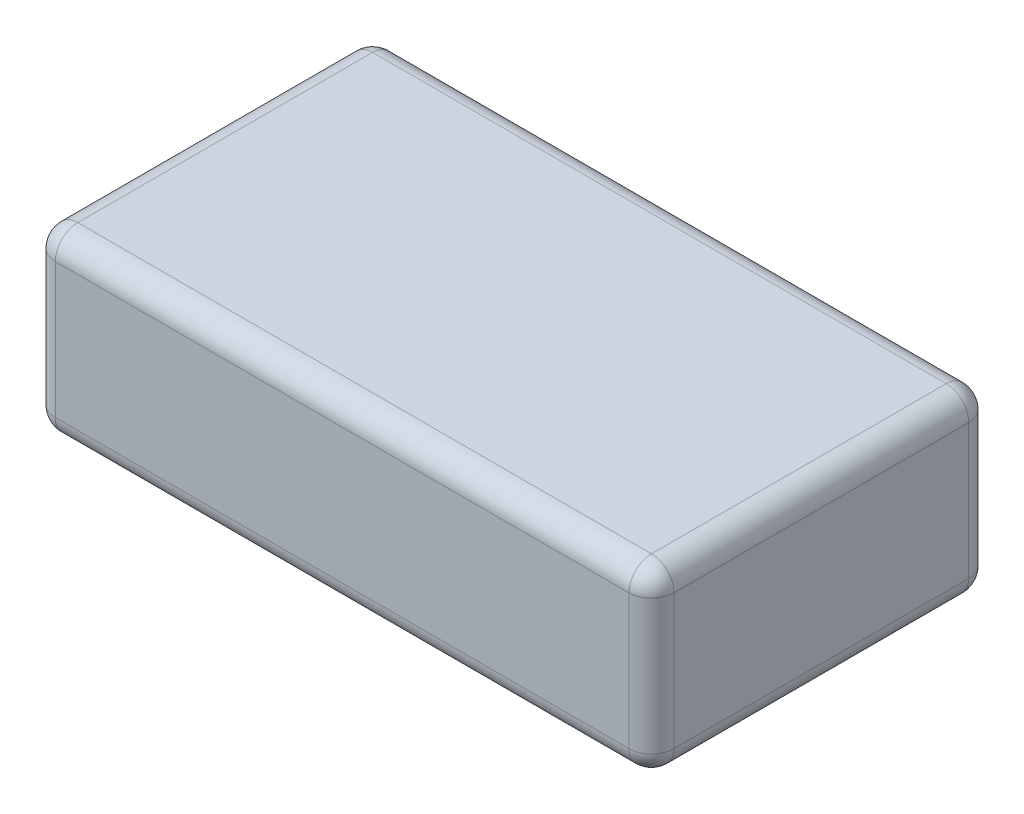
ISO-10303-21;
HEADER;
FILE_DESCRIPTION(('STEP AP214'),'2;1');
FILE_NAME('part.step','',(''),(''),'','','');
FILE_SCHEMA(('AUTOMOTIVE_DESIGN { 1 0 10303 214 1 1 1 1 }'));
ENDSEC;
DATA;
#1=APPLICATION_CONTEXT('core data for automotive mechanical design processes');
#2=APPLICATION_PROTOCOL_DEFINITION('international standard','automotive_design',2000,#1);
#3=PRODUCT_CONTEXT('',#1,'mechanical');
#4=PRODUCT('Part','Part','',(#3));
#5=PRODUCT_RELATED_PRODUCT_CATEGORY('part','',(#4));
#6=PRODUCT_DEFINITION_FORMATION('','',#4);
#7=PRODUCT_DEFINITION_CONTEXT('part definition',#1,'design');
#8=PRODUCT_DEFINITION('design','',#6,#7);
#9=PRODUCT_DEFINITION_SHAPE('','',#8);
#10=(LENGTH_UNIT() NAMED_UNIT(*) SI_UNIT(.MILLI.,.METRE.));
#11=(NAMED_UNIT(*) PLANE_ANGLE_UNIT() SI_UNIT($,.RADIAN.));
#12=(NAMED_UNIT(*) SI_UNIT($,.STERADIAN.) SOLID_ANGLE_UNIT());
#13=UNCERTAINTY_MEASURE_WITH_UNIT(LENGTH_MEASURE(1.E-05),#10,'distance_accuracy_value','');
#14=(GEOMETRIC_REPRESENTATION_CONTEXT(3) GLOBAL_UNCERTAINTY_ASSIGNED_CONTEXT((#13)) GLOBAL_UNIT_ASSIGNED_CONTEXT((#10,
#11,#12)) REPRESENTATION_CONTEXT('',''));
#15=CARTESIAN_POINT('',(0.,0.,0.));
#16=DIRECTION('',(0.,0.,1.));
#17=DIRECTION('',(1.,0.,0.));
#18=AXIS2_PLACEMENT_3D('',#15,#16,#17);
#19=CARTESIAN_POINT('',(27.5,16.,-15.1));
#20=DIRECTION('',(-1.,0.,0.));
#21=DIRECTION('',(0.,0.,1.));
#22=AXIS2_PLACEMENT_3D('',#19,#20,#21);
#23=PLANE('',#22);
#24=DIRECTION('',(0.,0.,-1.));
#25=VECTOR('',#24,1.);
#26=CARTESIAN_POINT('',(27.5,14.,15.1));
#27=LINE('',#26,#25);
#28=CARTESIAN_POINT('',(27.5,14.,-13.1));
#29=VERTEX_POINT('',#28);
#30=CARTESIAN_POINT('',(27.5,14.,13.1));
#31=VERTEX_POINT('',#30);
#32=EDGE_CURVE('E41',#29,#31,#27,.F.);
#33=ORIENTED_EDGE('',*,*,#32,.T.);
#34=DIRECTION('',(0.,-1.,0.));
#35=VECTOR('',#34,1.);
#36=CARTESIAN_POINT('',(27.5,16.,13.1));
#37=LINE('',#36,#35);
#38=CARTESIAN_POINT('',(27.5,2.,13.1));
#39=VERTEX_POINT('',#38);
#40=EDGE_CURVE('E11',#31,#39,#37,.T.);
#41=ORIENTED_EDGE('',*,*,#40,.T.);
#42=DIRECTION('',(0.,0.,-1.));
#43=VECTOR('',#42,1.);
#44=CARTESIAN_POINT('',(27.5,2.,-15.1));
#45=LINE('',#44,#43);
#46=CARTESIAN_POINT('',(27.5,2.,-13.1));
#47=VERTEX_POINT('',#46);
#48=EDGE_CURVE('E232',#39,#47,#45,.T.);
#49=ORIENTED_EDGE('',*,*,#48,.T.);
#50=DIRECTION('',(0.,-1.,0.));
#51=VECTOR('',#50,1.);
#52=CARTESIAN_POINT('',(27.5,16.,-13.1));
#53=LINE('',#52,#51);
#54=EDGE_CURVE('E52',#47,#29,#53,.F.);
#55=ORIENTED_EDGE('',*,*,#54,.T.);
#56=EDGE_LOOP('',(#33,#41,#49,#55));
#57=FACE_BOUND('',#56,.T.);
#58=ADVANCED_FACE('F32',(#57),#23,.F.);
#59=CARTESIAN_POINT('',(-27.5,16.,-15.1));
#60=DIRECTION('',(0.,0.,1.));
#61=DIRECTION('',(1.,0.,0.));
#62=AXIS2_PLACEMENT_3D('',#59,#60,#61);
#63=PLANE('',#62);
#64=DIRECTION('',(0.,-1.,0.));
#65=VECTOR('',#64,1.);
#66=CARTESIAN_POINT('',(-25.5,16.,-15.1));
#67=LINE('',#66,#65);
#68=CARTESIAN_POINT('',(-25.5,2.,-15.1));
#69=VERTEX_POINT('',#68);
#70=CARTESIAN_POINT('',(-25.5,14.,-15.1));
#71=VERTEX_POINT('',#70);
#72=EDGE_CURVE('E216',#69,#71,#67,.F.);
#73=ORIENTED_EDGE('',*,*,#72,.T.);
#74=DIRECTION('',(-1.,0.,0.));
#75=VECTOR('',#74,1.);
#76=CARTESIAN_POINT('',(27.5,14.,-15.1));
#77=LINE('',#76,#75);
#78=CARTESIAN_POINT('',(25.5,14.,-15.1));
#79=VERTEX_POINT('',#78);
#80=EDGE_CURVE('E213',#71,#79,#77,.F.);
#81=ORIENTED_EDGE('',*,*,#80,.T.);
#82=DIRECTION('',(0.,-1.,0.));
#83=VECTOR('',#82,1.);
#84=CARTESIAN_POINT('',(25.5,16.,-15.1));
#85=LINE('',#84,#83);
#86=CARTESIAN_POINT('',(25.5,2.,-15.1));
#87=VERTEX_POINT('',#86);
#88=EDGE_CURVE('E206',#79,#87,#85,.T.);
#89=ORIENTED_EDGE('',*,*,#88,.T.);
#90=DIRECTION('',(-1.,0.,0.));
#91=VECTOR('',#90,1.);
#92=CARTESIAN_POINT('',(-27.5,2.,-15.1));
#93=LINE('',#92,#91);
#94=EDGE_CURVE('E209',#87,#69,#93,.T.);
#95=ORIENTED_EDGE('',*,*,#94,.T.);
#96=EDGE_LOOP('',(#73,#81,#89,#95));
#97=FACE_BOUND('',#96,.T.);
#98=ADVANCED_FACE('F214',(#97),#63,.F.);
#99=CARTESIAN_POINT('',(-27.5,16.,-15.1));
#100=DIRECTION('',(1.,0.,0.));
#101=DIRECTION('',(0.,0.,-1.));
#102=AXIS2_PLACEMENT_3D('',#99,#100,#101);
#103=PLANE('',#102);
#104=DIRECTION('',(0.,0.,1.));
#105=VECTOR('',#104,1.);
#106=CARTESIAN_POINT('',(-27.5,2.,-15.1));
#107=LINE('',#106,#105);
#108=CARTESIAN_POINT('',(-27.5,2.,-13.1));
#109=VERTEX_POINT('',#108);
#110=CARTESIAN_POINT('',(-27.5,2.,13.1));
#111=VERTEX_POINT('',#110);
#112=EDGE_CURVE('E269',#109,#111,#107,.T.);
#113=ORIENTED_EDGE('',*,*,#112,.T.);
#114=DIRECTION('',(0.,-1.,0.));
#115=VECTOR('',#114,1.);
#116=CARTESIAN_POINT('',(-27.5,16.,13.1));
#117=LINE('',#116,#115);
#118=CARTESIAN_POINT('',(-27.5,14.,13.1));
#119=VERTEX_POINT('',#118);
#120=EDGE_CURVE('E263',#111,#119,#117,.F.);
#121=ORIENTED_EDGE('',*,*,#120,.T.);
#122=DIRECTION('',(0.,0.,1.));
#123=VECTOR('',#122,1.);
#124=CARTESIAN_POINT('',(-27.5,14.,-15.1));
#125=LINE('',#124,#123);
#126=CARTESIAN_POINT('',(-27.5,14.,-13.1));
#127=VERTEX_POINT('',#126);
#128=EDGE_CURVE('E257',#119,#127,#125,.F.);
#129=ORIENTED_EDGE('',*,*,#128,.T.);
#130=DIRECTION('',(0.,-1.,0.));
#131=VECTOR('',#130,1.);
#132=CARTESIAN_POINT('',(-27.5,16.,-13.1));
#133=LINE('',#132,#131);
#134=EDGE_CURVE('E264',#127,#109,#133,.T.);
#135=ORIENTED_EDGE('',*,*,#134,.T.);
#136=EDGE_LOOP('',(#113,#121,#129,#135));
#137=FACE_BOUND('',#136,.T.);
#138=ADVANCED_FACE('F267',(#137),#103,.F.);
#139=CARTESIAN_POINT('',(-27.5,16.,15.1));
#140=DIRECTION('',(0.,0.,-1.));
#141=DIRECTION('',(-1.,0.,0.));
#142=AXIS2_PLACEMENT_3D('',#139,#140,#141);
#143=PLANE('',#142);
#144=DIRECTION('',(1.,0.,0.));
#145=VECTOR('',#144,1.);
#146=CARTESIAN_POINT('',(-27.5,14.,15.1));
#147=LINE('',#146,#145);
#148=CARTESIAN_POINT('',(25.5,14.,15.1));
#149=VERTEX_POINT('',#148);
#150=CARTESIAN_POINT('',(-25.5,14.,15.1));
#151=VERTEX_POINT('',#150);
#152=EDGE_CURVE('E131',#149,#151,#147,.F.);
#153=ORIENTED_EDGE('',*,*,#152,.T.);
#154=DIRECTION('',(0.,-1.,0.));
#155=VECTOR('',#154,1.);
#156=CARTESIAN_POINT('',(-25.5,16.,15.1));
#157=LINE('',#156,#155);
#158=CARTESIAN_POINT('',(-25.5,2.,15.1));
#159=VERTEX_POINT('',#158);
#160=EDGE_CURVE('E127',#151,#159,#157,.T.);
#161=ORIENTED_EDGE('',*,*,#160,.T.);
#162=DIRECTION('',(1.,0.,0.));
#163=VECTOR('',#162,1.);
#164=CARTESIAN_POINT('',(-27.5,2.,15.1));
#165=LINE('',#164,#163);
#166=CARTESIAN_POINT('',(25.5,2.,15.1));
#167=VERTEX_POINT('',#166);
#168=EDGE_CURVE('E121',#159,#167,#165,.T.);
#169=ORIENTED_EDGE('',*,*,#168,.T.);
#170=DIRECTION('',(0.,-1.,0.));
#171=VECTOR('',#170,1.);
#172=CARTESIAN_POINT('',(25.5,16.,15.1));
#173=LINE('',#172,#171);
#174=EDGE_CURVE('E124',#167,#149,#173,.F.);
#175=ORIENTED_EDGE('',*,*,#174,.T.);
#176=EDGE_LOOP('',(#153,#161,#169,#175));
#177=FACE_BOUND('',#176,.T.);
#178=ADVANCED_FACE('F123',(#177),#143,.F.);
#179=CARTESIAN_POINT('',(0.,16.,0.));
#180=DIRECTION('',(0.,1.,0.));
#181=DIRECTION('',(0.,0.,1.));
#182=AXIS2_PLACEMENT_3D('',#179,#180,#181);
#183=PLANE('',#182);
#184=DIRECTION('',(0.,0.,1.));
#185=VECTOR('',#184,1.);
#186=CARTESIAN_POINT('',(-25.5,16.,15.1));
#187=LINE('',#186,#185);
#188=CARTESIAN_POINT('',(-25.5,16.,-13.1));
#189=VERTEX_POINT('',#188);
#190=CARTESIAN_POINT('',(-25.5,16.,13.1));
#191=VERTEX_POINT('',#190);
#192=EDGE_CURVE('E280',#189,#191,#187,.T.);
#193=ORIENTED_EDGE('',*,*,#192,.T.);
#194=DIRECTION('',(1.,0.,0.));
#195=VECTOR('',#194,1.);
#196=CARTESIAN_POINT('',(27.5,16.,13.1));
#197=LINE('',#196,#195);
#198=CARTESIAN_POINT('',(25.5,16.,13.1));
#199=VERTEX_POINT('',#198);
#200=EDGE_CURVE('E210',#191,#199,#197,.T.);
#201=ORIENTED_EDGE('',*,*,#200,.T.);
#202=DIRECTION('',(0.,0.,-1.));
#203=VECTOR('',#202,1.);
#204=CARTESIAN_POINT('',(25.5,16.,-15.1));
#205=LINE('',#204,#203);
#206=CARTESIAN_POINT('',(25.5,16.,-13.1));
#207=VERTEX_POINT('',#206);
#208=EDGE_CURVE('E273',#199,#207,#205,.T.);
#209=ORIENTED_EDGE('',*,*,#208,.T.);
#210=DIRECTION('',(-1.,0.,0.));
#211=VECTOR('',#210,1.);
#212=CARTESIAN_POINT('',(-27.5,16.,-13.1));
#213=LINE('',#212,#211);
#214=EDGE_CURVE('E275',#207,#189,#213,.T.);
#215=ORIENTED_EDGE('',*,*,#214,.T.);
#216=EDGE_LOOP('',(#193,#201,#209,#215));
#217=FACE_BOUND('',#216,.T.);
#218=ADVANCED_FACE('F305',(#217),#183,.T.);
#219=CARTESIAN_POINT('',(0.,0.,0.));
#220=DIRECTION('',(0.,1.,0.));
#221=DIRECTION('',(0.,0.,1.));
#222=AXIS2_PLACEMENT_3D('',#219,#220,#221);
#223=PLANE('',#222);
#224=DIRECTION('',(0.,0.,1.));
#225=VECTOR('',#224,1.);
#226=CARTESIAN_POINT('',(-25.5,0.,0.));
#227=LINE('',#226,#225);
#228=CARTESIAN_POINT('',(-25.5,0.,13.1));
#229=VERTEX_POINT('',#228);
#230=CARTESIAN_POINT('',(-25.5,0.,-13.1));
#231=VERTEX_POINT('',#230);
#232=EDGE_CURVE('E227',#229,#231,#227,.F.);
#233=ORIENTED_EDGE('',*,*,#232,.T.);
#234=DIRECTION('',(-1.,0.,0.));
#235=VECTOR('',#234,1.);
#236=CARTESIAN_POINT('',(0.,0.,-13.1));
#237=LINE('',#236,#235);
#238=CARTESIAN_POINT('',(25.5,0.,-13.1));
#239=VERTEX_POINT('',#238);
#240=EDGE_CURVE('E229',#231,#239,#237,.F.);
#241=ORIENTED_EDGE('',*,*,#240,.T.);
#242=DIRECTION('',(0.,0.,-1.));
#243=VECTOR('',#242,1.);
#244=CARTESIAN_POINT('',(25.5,0.,0.));
#245=LINE('',#244,#243);
#246=CARTESIAN_POINT('',(25.5,0.,13.1));
#247=VERTEX_POINT('',#246);
#248=EDGE_CURVE('E220',#239,#247,#245,.F.);
#249=ORIENTED_EDGE('',*,*,#248,.T.);
#250=DIRECTION('',(1.,0.,0.));
#251=VECTOR('',#250,1.);
#252=CARTESIAN_POINT('',(0.,0.,13.1));
#253=LINE('',#252,#251);
#254=EDGE_CURVE('E152',#247,#229,#253,.F.);
#255=ORIENTED_EDGE('',*,*,#254,.T.);
#256=EDGE_LOOP('',(#233,#241,#249,#255));
#257=FACE_BOUND('',#256,.T.);
#258=ADVANCED_FACE('F476',(#257),#223,.F.);
#259=CARTESIAN_POINT('',(25.5,16.,-13.1));
#260=DIRECTION('',(0.,-1.,0.));
#261=DIRECTION('',(0.,0.,-1.));
#262=AXIS2_PLACEMENT_3D('',#259,#260,#261);
#263=CYLINDRICAL_SURFACE('',#262,2.);
#264=CARTESIAN_POINT('',(25.5,14.,-13.1));
#265=DIRECTION('',(0.,1.,0.));
#266=DIRECTION('',(0.,0.,1.));
#267=AXIS2_PLACEMENT_3D('',#264,#265,#266);
#268=CIRCLE('',#267,2.);
#269=EDGE_CURVE('E36',#29,#79,#268,.T.);
#270=ORIENTED_EDGE('',*,*,#269,.F.);
#271=ORIENTED_EDGE('',*,*,#54,.F.);
#272=CARTESIAN_POINT('',(25.5,2.,-13.1));
#273=DIRECTION('',(0.,-1.,0.));
#274=DIRECTION('',(0.,0.,-1.));
#275=AXIS2_PLACEMENT_3D('',#272,#273,#274);
#276=CIRCLE('',#275,2.);
#277=EDGE_CURVE('E192',#87,#47,#276,.T.);
#278=ORIENTED_EDGE('',*,*,#277,.F.);
#279=ORIENTED_EDGE('',*,*,#88,.F.);
#280=EDGE_LOOP('',(#270,#271,#278,#279));
#281=FACE_BOUND('',#280,.T.);
#282=ADVANCED_FACE('F34',(#281),#263,.T.);
#283=CARTESIAN_POINT('',(25.5,14.,-13.1));
#284=DIRECTION('',(0.,0.,1.));
#285=DIRECTION('',(1.,0.,0.));
#286=AXIS2_PLACEMENT_3D('',#283,#284,#285);
#287=SPHERICAL_SURFACE('',#286,2.);
#288=CARTESIAN_POINT('',(25.5,14.,-13.1));
#289=DIRECTION('',(0.,0.,-1.));
#290=DIRECTION('',(-1.,0.,0.));
#291=AXIS2_PLACEMENT_3D('',#288,#289,#290);
#292=CIRCLE('',#291,2.);
#293=EDGE_CURVE('E188',#29,#207,#292,.F.);
#294=ORIENTED_EDGE('',*,*,#293,.F.);
#295=ORIENTED_EDGE('',*,*,#269,.T.);
#296=CARTESIAN_POINT('',(25.5,14.,-13.1));
#297=DIRECTION('',(1.,0.,0.));
#298=DIRECTION('',(0.,0.,-1.));
#299=AXIS2_PLACEMENT_3D('',#296,#297,#298);
#300=CIRCLE('',#299,2.);
#301=EDGE_CURVE('E191',#207,#79,#300,.F.);
#302=ORIENTED_EDGE('',*,*,#301,.F.);
#303=EDGE_LOOP('',(#294,#295,#302));
#304=FACE_BOUND('',#303,.T.);
#305=ADVANCED_FACE('F203',(#304),#287,.T.);
#306=CARTESIAN_POINT('',(25.5,2.,-13.1));
#307=DIRECTION('',(0.,0.,1.));
#308=DIRECTION('',(1.,0.,0.));
#309=AXIS2_PLACEMENT_3D('',#306,#307,#308);
#310=SPHERICAL_SURFACE('',#309,2.);
#311=CARTESIAN_POINT('',(25.5,2.,-13.1));
#312=DIRECTION('',(1.,0.,0.));
#313=DIRECTION('',(0.,0.,-1.));
#314=AXIS2_PLACEMENT_3D('',#311,#312,#313);
#315=CIRCLE('',#314,2.);
#316=EDGE_CURVE('E182',#87,#239,#315,.F.);
#317=ORIENTED_EDGE('',*,*,#316,.F.);
#318=ORIENTED_EDGE('',*,*,#277,.T.);
#319=CARTESIAN_POINT('',(25.5,2.,-13.1));
#320=DIRECTION('',(0.,0.,-1.));
#321=DIRECTION('',(-1.,0.,0.));
#322=AXIS2_PLACEMENT_3D('',#319,#320,#321);
#323=CIRCLE('',#322,2.);
#324=EDGE_CURVE('E185',#239,#47,#323,.F.);
#325=ORIENTED_EDGE('',*,*,#324,.F.);
#326=EDGE_LOOP('',(#317,#318,#325));
#327=FACE_BOUND('',#326,.T.);
#328=ADVANCED_FACE('F455',(#327),#310,.T.);
#329=CARTESIAN_POINT('',(0.,14.,-13.1));
#330=DIRECTION('',(1.,0.,0.));
#331=DIRECTION('',(0.,0.,-1.));
#332=AXIS2_PLACEMENT_3D('',#329,#330,#331);
#333=CYLINDRICAL_SURFACE('',#332,2.);
#334=ORIENTED_EDGE('',*,*,#301,.T.);
#335=ORIENTED_EDGE('',*,*,#80,.F.);
#336=CARTESIAN_POINT('',(-25.5,14.,-13.1));
#337=DIRECTION('',(-1.,0.,0.));
#338=DIRECTION('',(0.,0.,1.));
#339=AXIS2_PLACEMENT_3D('',#336,#337,#338);
#340=CIRCLE('',#339,2.);
#341=EDGE_CURVE('E176',#189,#71,#340,.T.);
#342=ORIENTED_EDGE('',*,*,#341,.F.);
#343=ORIENTED_EDGE('',*,*,#214,.F.);
#344=EDGE_LOOP('',(#334,#335,#342,#343));
#345=FACE_BOUND('',#344,.T.);
#346=ADVANCED_FACE('F307',(#345),#333,.T.);
#347=CARTESIAN_POINT('',(25.5,14.,0.));
#348=DIRECTION('',(0.,0.,1.));
#349=DIRECTION('',(1.,0.,0.));
#350=AXIS2_PLACEMENT_3D('',#347,#348,#349);
#351=CYLINDRICAL_SURFACE('',#350,2.);
#352=ORIENTED_EDGE('',*,*,#293,.T.);
#353=ORIENTED_EDGE('',*,*,#208,.F.);
#354=CARTESIAN_POINT('',(25.5,14.,13.1));
#355=DIRECTION('',(0.,0.,1.));
#356=DIRECTION('',(0.,-1.,0.));
#357=AXIS2_PLACEMENT_3D('',#354,#355,#356);
#358=CIRCLE('',#357,2.);
#359=EDGE_CURVE('E173',#31,#199,#358,.T.);
#360=ORIENTED_EDGE('',*,*,#359,.F.);
#361=ORIENTED_EDGE('',*,*,#32,.F.);
#362=EDGE_LOOP('',(#352,#353,#360,#361));
#363=FACE_BOUND('',#362,.T.);
#364=ADVANCED_FACE('F439',(#363),#351,.T.);
#365=CARTESIAN_POINT('',(25.5,16.,13.1));
#366=DIRECTION('',(0.,-1.,0.));
#367=DIRECTION('',(0.,0.,-1.));
#368=AXIS2_PLACEMENT_3D('',#365,#366,#367);
#369=CYLINDRICAL_SURFACE('',#368,2.);
#370=CARTESIAN_POINT('',(25.5,2.,13.1));
#371=DIRECTION('',(0.,-1.,0.));
#372=DIRECTION('',(0.,0.,-1.));
#373=AXIS2_PLACEMENT_3D('',#370,#371,#372);
#374=CIRCLE('',#373,2.);
#375=EDGE_CURVE('E137',#39,#167,#374,.T.);
#376=ORIENTED_EDGE('',*,*,#375,.F.);
#377=ORIENTED_EDGE('',*,*,#40,.F.);
#378=CARTESIAN_POINT('',(25.5,14.,13.1));
#379=DIRECTION('',(0.,1.,0.));
#380=DIRECTION('',(0.,0.,1.));
#381=AXIS2_PLACEMENT_3D('',#378,#379,#380);
#382=CIRCLE('',#381,2.);
#383=EDGE_CURVE('E140',#149,#31,#382,.T.);
#384=ORIENTED_EDGE('',*,*,#383,.F.);
#385=ORIENTED_EDGE('',*,*,#174,.F.);
#386=EDGE_LOOP('',(#376,#377,#384,#385));
#387=FACE_BOUND('',#386,.T.);
#388=ADVANCED_FACE('F136',(#387),#369,.T.);
#389=CARTESIAN_POINT('',(25.5,2.,-15.1));
#390=DIRECTION('',(0.,0.,-1.));
#391=DIRECTION('',(-1.,0.,0.));
#392=AXIS2_PLACEMENT_3D('',#389,#390,#391);
#393=CYLINDRICAL_SURFACE('',#392,2.);
#394=ORIENTED_EDGE('',*,*,#324,.T.);
#395=ORIENTED_EDGE('',*,*,#48,.F.);
#396=CARTESIAN_POINT('',(25.5,2.,13.1));
#397=DIRECTION('',(0.,0.,1.));
#398=DIRECTION('',(1.,0.,0.));
#399=AXIS2_PLACEMENT_3D('',#396,#397,#398);
#400=CIRCLE('',#399,2.);
#401=EDGE_CURVE('E149',#247,#39,#400,.T.);
#402=ORIENTED_EDGE('',*,*,#401,.F.);
#403=ORIENTED_EDGE('',*,*,#248,.F.);
#404=EDGE_LOOP('',(#394,#395,#402,#403));
#405=FACE_BOUND('',#404,.T.);
#406=ADVANCED_FACE('F423',(#405),#393,.T.);
#407=CARTESIAN_POINT('',(-27.5,2.,-13.1));
#408=DIRECTION('',(-1.,0.,0.));
#409=DIRECTION('',(0.,0.,1.));
#410=AXIS2_PLACEMENT_3D('',#407,#408,#409);
#411=CYLINDRICAL_SURFACE('',#410,2.);
#412=ORIENTED_EDGE('',*,*,#316,.T.);
#413=ORIENTED_EDGE('',*,*,#240,.F.);
#414=CARTESIAN_POINT('',(-25.5,2.,-13.1));
#415=DIRECTION('',(-1.,0.,0.));
#416=DIRECTION('',(0.,0.,1.));
#417=AXIS2_PLACEMENT_3D('',#414,#415,#416);
#418=CIRCLE('',#417,2.);
#419=EDGE_CURVE('E168',#69,#231,#418,.T.);
#420=ORIENTED_EDGE('',*,*,#419,.F.);
#421=ORIENTED_EDGE('',*,*,#94,.F.);
#422=EDGE_LOOP('',(#412,#413,#420,#421));
#423=FACE_BOUND('',#422,.T.);
#424=ADVANCED_FACE('F291',(#423),#411,.T.);
#425=CARTESIAN_POINT('',(-25.5,16.,-13.1));
#426=DIRECTION('',(0.,-1.,0.));
#427=DIRECTION('',(0.,0.,-1.));
#428=AXIS2_PLACEMENT_3D('',#425,#426,#427);
#429=CYLINDRICAL_SURFACE('',#428,2.);
#430=CARTESIAN_POINT('',(-25.5,14.,-13.1));
#431=DIRECTION('',(0.,1.,0.));
#432=DIRECTION('',(0.,0.,1.));
#433=AXIS2_PLACEMENT_3D('',#430,#431,#432);
#434=CIRCLE('',#433,2.);
#435=EDGE_CURVE('E179',#71,#127,#434,.T.);
#436=ORIENTED_EDGE('',*,*,#435,.F.);
#437=ORIENTED_EDGE('',*,*,#72,.F.);
#438=CARTESIAN_POINT('',(-25.5,2.,-13.1));
#439=DIRECTION('',(0.,-1.,0.));
#440=DIRECTION('',(0.,0.,-1.));
#441=AXIS2_PLACEMENT_3D('',#438,#439,#440);
#442=CIRCLE('',#441,2.);
#443=EDGE_CURVE('E165',#109,#69,#442,.T.);
#444=ORIENTED_EDGE('',*,*,#443,.F.);
#445=ORIENTED_EDGE('',*,*,#134,.F.);
#446=EDGE_LOOP('',(#436,#437,#444,#445));
#447=FACE_BOUND('',#446,.T.);
#448=ADVANCED_FACE('F288',(#447),#429,.T.);
#449=CARTESIAN_POINT('',(-25.5,14.,-13.1));
#450=DIRECTION('',(0.,0.,1.));
#451=DIRECTION('',(1.,0.,0.));
#452=AXIS2_PLACEMENT_3D('',#449,#450,#451);
#453=SPHERICAL_SURFACE('',#452,2.);
#454=ORIENTED_EDGE('',*,*,#341,.T.);
#455=ORIENTED_EDGE('',*,*,#435,.T.);
#456=CARTESIAN_POINT('',(-25.5,14.,-13.1));
#457=DIRECTION('',(0.,0.,-1.));
#458=DIRECTION('',(-1.,0.,0.));
#459=AXIS2_PLACEMENT_3D('',#456,#457,#458);
#460=CIRCLE('',#459,2.);
#461=EDGE_CURVE('E156',#189,#127,#460,.F.);
#462=ORIENTED_EDGE('',*,*,#461,.F.);
#463=EDGE_LOOP('',(#454,#455,#462));
#464=FACE_BOUND('',#463,.T.);
#465=ADVANCED_FACE('F309',(#464),#453,.T.);
#466=CARTESIAN_POINT('',(25.5,14.,13.1));
#467=DIRECTION('',(0.,0.,1.));
#468=DIRECTION('',(1.,0.,0.));
#469=AXIS2_PLACEMENT_3D('',#466,#467,#468);
#470=SPHERICAL_SURFACE('',#469,2.);
#471=ORIENTED_EDGE('',*,*,#383,.T.);
#472=ORIENTED_EDGE('',*,*,#359,.T.);
#473=CARTESIAN_POINT('',(25.5,14.,13.1));
#474=DIRECTION('',(1.,0.,0.));
#475=DIRECTION('',(0.,0.,-1.));
#476=AXIS2_PLACEMENT_3D('',#473,#474,#475);
#477=CIRCLE('',#476,2.);
#478=EDGE_CURVE('E153',#149,#199,#477,.F.);
#479=ORIENTED_EDGE('',*,*,#478,.F.);
#480=EDGE_LOOP('',(#471,#472,#479));
#481=FACE_BOUND('',#480,.T.);
#482=ADVANCED_FACE('F311',(#481),#470,.T.);
#483=CARTESIAN_POINT('',(25.5,2.,13.1));
#484=DIRECTION('',(0.,0.,1.));
#485=DIRECTION('',(1.,0.,0.));
#486=AXIS2_PLACEMENT_3D('',#483,#484,#485);
#487=SPHERICAL_SURFACE('',#486,2.);
#488=ORIENTED_EDGE('',*,*,#401,.T.);
#489=ORIENTED_EDGE('',*,*,#375,.T.);
#490=CARTESIAN_POINT('',(25.5,2.,13.1));
#491=DIRECTION('',(1.,0.,0.));
#492=DIRECTION('',(0.,0.,-1.));
#493=AXIS2_PLACEMENT_3D('',#490,#491,#492);
#494=CIRCLE('',#493,2.);
#495=EDGE_CURVE('E146',#247,#167,#494,.F.);
#496=ORIENTED_EDGE('',*,*,#495,.F.);
#497=EDGE_LOOP('',(#488,#489,#496));
#498=FACE_BOUND('',#497,.T.);
#499=ADVANCED_FACE('F145',(#498),#487,.T.);
#500=CARTESIAN_POINT('',(-25.5,2.,-13.1));
#501=DIRECTION('',(0.,0.,1.));
#502=DIRECTION('',(1.,0.,0.));
#503=AXIS2_PLACEMENT_3D('',#500,#501,#502);
#504=SPHERICAL_SURFACE('',#503,2.);
#505=ORIENTED_EDGE('',*,*,#443,.T.);
#506=ORIENTED_EDGE('',*,*,#419,.T.);
#507=CARTESIAN_POINT('',(-25.5,2.,-13.1));
#508=DIRECTION('',(0.,0.,-1.));
#509=DIRECTION('',(-1.,0.,0.));
#510=AXIS2_PLACEMENT_3D('',#507,#508,#509);
#511=CIRCLE('',#510,2.);
#512=EDGE_CURVE('E154',#109,#231,#511,.F.);
#513=ORIENTED_EDGE('',*,*,#512,.F.);
#514=EDGE_LOOP('',(#505,#506,#513));
#515=FACE_BOUND('',#514,.T.);
#516=ADVANCED_FACE('F293',(#515),#504,.T.);
#517=CARTESIAN_POINT('',(-25.5,14.,0.));
#518=DIRECTION('',(0.,0.,-1.));
#519=DIRECTION('',(-1.,0.,0.));
#520=AXIS2_PLACEMENT_3D('',#517,#518,#519);
#521=CYLINDRICAL_SURFACE('',#520,2.);
#522=ORIENTED_EDGE('',*,*,#461,.T.);
#523=ORIENTED_EDGE('',*,*,#128,.F.);
#524=CARTESIAN_POINT('',(-25.5,14.,13.1));
#525=DIRECTION('',(0.,0.,1.));
#526=DIRECTION('',(1.,0.,0.));
#527=AXIS2_PLACEMENT_3D('',#524,#525,#526);
#528=CIRCLE('',#527,2.);
#529=EDGE_CURVE('E159',#191,#119,#528,.T.);
#530=ORIENTED_EDGE('',*,*,#529,.F.);
#531=ORIENTED_EDGE('',*,*,#192,.F.);
#532=EDGE_LOOP('',(#522,#523,#530,#531));
#533=FACE_BOUND('',#532,.T.);
#534=ADVANCED_FACE('F259',(#533),#521,.T.);
#535=CARTESIAN_POINT('',(0.,14.,13.1));
#536=DIRECTION('',(-1.,0.,0.));
#537=DIRECTION('',(0.,0.,1.));
#538=AXIS2_PLACEMENT_3D('',#535,#536,#537);
#539=CYLINDRICAL_SURFACE('',#538,2.);
#540=ORIENTED_EDGE('',*,*,#478,.T.);
#541=ORIENTED_EDGE('',*,*,#200,.F.);
#542=CARTESIAN_POINT('',(-25.5,14.,13.1));
#543=DIRECTION('',(-1.,0.,0.));
#544=DIRECTION('',(0.,0.,1.));
#545=AXIS2_PLACEMENT_3D('',#542,#543,#544);
#546=CIRCLE('',#545,2.);
#547=EDGE_CURVE('E246',#151,#191,#546,.T.);
#548=ORIENTED_EDGE('',*,*,#547,.F.);
#549=ORIENTED_EDGE('',*,*,#152,.F.);
#550=EDGE_LOOP('',(#540,#541,#548,#549));
#551=FACE_BOUND('',#550,.T.);
#552=ADVANCED_FACE('F303',(#551),#539,.T.);
#553=CARTESIAN_POINT('',(-27.5,2.,13.1));
#554=DIRECTION('',(1.,0.,0.));
#555=DIRECTION('',(0.,0.,-1.));
#556=AXIS2_PLACEMENT_3D('',#553,#554,#555);
#557=CYLINDRICAL_SURFACE('',#556,2.);
#558=ORIENTED_EDGE('',*,*,#495,.T.);
#559=ORIENTED_EDGE('',*,*,#168,.F.);
#560=CARTESIAN_POINT('',(-25.5,2.,13.1));
#561=DIRECTION('',(-1.,0.,0.));
#562=DIRECTION('',(0.,0.,1.));
#563=AXIS2_PLACEMENT_3D('',#560,#561,#562);
#564=CIRCLE('',#563,2.);
#565=EDGE_CURVE('E243',#229,#159,#564,.T.);
#566=ORIENTED_EDGE('',*,*,#565,.F.);
#567=ORIENTED_EDGE('',*,*,#254,.F.);
#568=EDGE_LOOP('',(#558,#559,#566,#567));
#569=FACE_BOUND('',#568,.T.);
#570=ADVANCED_FACE('F151',(#569),#557,.T.);
#571=CARTESIAN_POINT('',(-25.5,2.,-15.1));
#572=DIRECTION('',(0.,0.,1.));
#573=DIRECTION('',(1.,0.,0.));
#574=AXIS2_PLACEMENT_3D('',#571,#572,#573);
#575=CYLINDRICAL_SURFACE('',#574,2.);
#576=ORIENTED_EDGE('',*,*,#512,.T.);
#577=ORIENTED_EDGE('',*,*,#232,.F.);
#578=CARTESIAN_POINT('',(-25.5,2.,13.1));
#579=DIRECTION('',(0.,0.,1.));
#580=DIRECTION('',(1.,0.,0.));
#581=AXIS2_PLACEMENT_3D('',#578,#579,#580);
#582=CIRCLE('',#581,2.);
#583=EDGE_CURVE('E240',#111,#229,#582,.T.);
#584=ORIENTED_EDGE('',*,*,#583,.F.);
#585=ORIENTED_EDGE('',*,*,#112,.F.);
#586=EDGE_LOOP('',(#576,#577,#584,#585));
#587=FACE_BOUND('',#586,.T.);
#588=ADVANCED_FACE('F296',(#587),#575,.T.);
#589=CARTESIAN_POINT('',(-25.5,14.,13.1));
#590=DIRECTION('',(0.,0.,1.));
#591=DIRECTION('',(1.,0.,0.));
#592=AXIS2_PLACEMENT_3D('',#589,#590,#591);
#593=SPHERICAL_SURFACE('',#592,2.);
#594=ORIENTED_EDGE('',*,*,#547,.T.);
#595=ORIENTED_EDGE('',*,*,#529,.T.);
#596=CARTESIAN_POINT('',(-25.5,14.,13.1));
#597=DIRECTION('',(0.,1.,0.));
#598=DIRECTION('',(0.,0.,1.));
#599=AXIS2_PLACEMENT_3D('',#596,#597,#598);
#600=CIRCLE('',#599,2.);
#601=EDGE_CURVE('E238',#151,#119,#600,.F.);
#602=ORIENTED_EDGE('',*,*,#601,.F.);
#603=EDGE_LOOP('',(#594,#595,#602));
#604=FACE_BOUND('',#603,.T.);
#605=ADVANCED_FACE('F253',(#604),#593,.T.);
#606=CARTESIAN_POINT('',(-25.5,2.,13.1));
#607=DIRECTION('',(0.,0.,1.));
#608=DIRECTION('',(1.,0.,0.));
#609=AXIS2_PLACEMENT_3D('',#606,#607,#608);
#610=SPHERICAL_SURFACE('',#609,2.);
#611=ORIENTED_EDGE('',*,*,#583,.T.);
#612=ORIENTED_EDGE('',*,*,#565,.T.);
#613=CARTESIAN_POINT('',(-25.5,2.,13.1));
#614=DIRECTION('',(0.,-1.,0.));
#615=DIRECTION('',(0.,0.,-1.));
#616=AXIS2_PLACEMENT_3D('',#613,#614,#615);
#617=CIRCLE('',#616,2.);
#618=EDGE_CURVE('E236',#111,#159,#617,.F.);
#619=ORIENTED_EDGE('',*,*,#618,.F.);
#620=EDGE_LOOP('',(#611,#612,#619));
#621=FACE_BOUND('',#620,.T.);
#622=ADVANCED_FACE('F331',(#621),#610,.T.);
#623=CARTESIAN_POINT('',(-25.5,16.,13.1));
#624=DIRECTION('',(0.,-1.,0.));
#625=DIRECTION('',(0.,0.,-1.));
#626=AXIS2_PLACEMENT_3D('',#623,#624,#625);
#627=CYLINDRICAL_SURFACE('',#626,2.);
#628=ORIENTED_EDGE('',*,*,#601,.T.);
#629=ORIENTED_EDGE('',*,*,#120,.F.);
#630=ORIENTED_EDGE('',*,*,#618,.T.);
#631=ORIENTED_EDGE('',*,*,#160,.F.);
#632=EDGE_LOOP('',(#628,#629,#630,#631));
#633=FACE_BOUND('',#632,.T.);
#634=ADVANCED_FACE('F328',(#633),#627,.T.);
#635=CLOSED_SHELL('',(#58,#98,#138,#178,#218,#258,#282,#305,#328,#346,#364,#388,#406,#424,#448,
#465,#482,#499,#516,#534,#552,#570,#588,#605,#622,#634));
#636=MANIFOLD_SOLID_BREP('B2',#635);
#637=ADVANCED_BREP_SHAPE_REPRESENTATION('',(#18,#636),#14);
#638=SHAPE_DEFINITION_REPRESENTATION(#9,#637);
ENDSEC;
END-ISO-10303-21;
